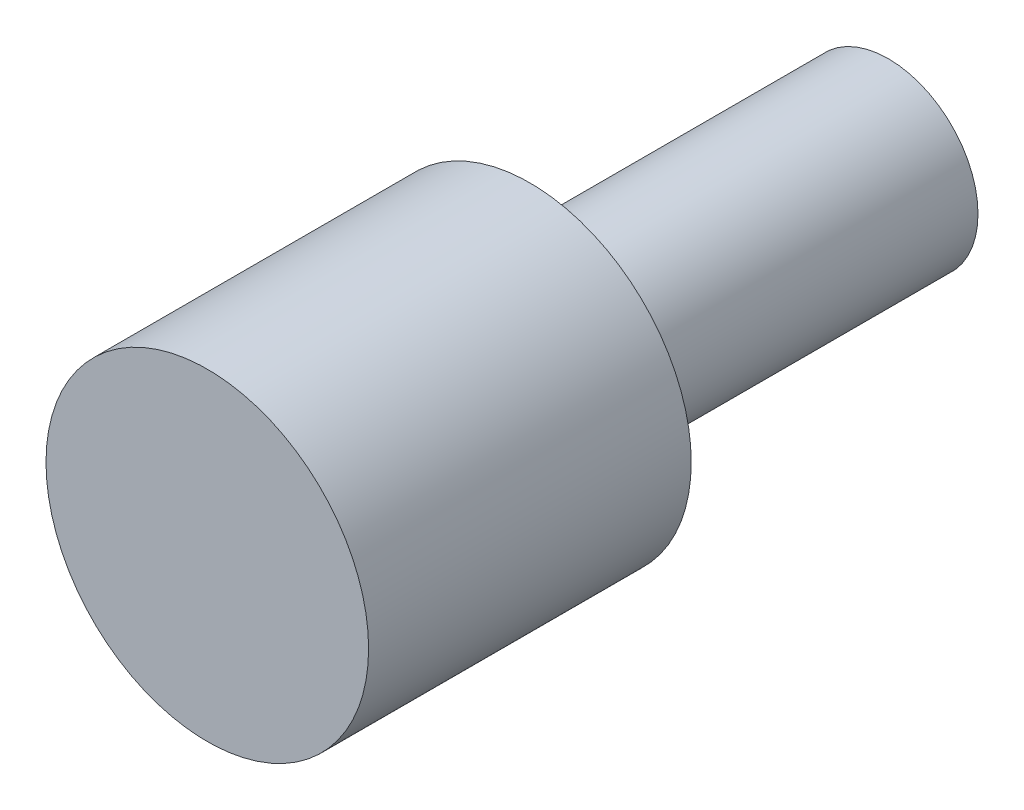
ISO-10303-21;
HEADER;
FILE_DESCRIPTION(('STEP AP214'),'2;1');
FILE_NAME('part.step','',(''),(''),'','','');
FILE_SCHEMA(('AUTOMOTIVE_DESIGN { 1 0 10303 214 1 1 1 1 }'));
ENDSEC;
DATA;
#1=APPLICATION_CONTEXT('core data for automotive mechanical design processes');
#2=APPLICATION_PROTOCOL_DEFINITION('international standard','automotive_design',2000,#1);
#3=PRODUCT_CONTEXT('',#1,'mechanical');
#4=PRODUCT('Part','Part','',(#3));
#5=PRODUCT_RELATED_PRODUCT_CATEGORY('part','',(#4));
#6=PRODUCT_DEFINITION_FORMATION('','',#4);
#7=PRODUCT_DEFINITION_CONTEXT('part definition',#1,'design');
#8=PRODUCT_DEFINITION('design','',#6,#7);
#9=PRODUCT_DEFINITION_SHAPE('','',#8);
#10=(LENGTH_UNIT() NAMED_UNIT(*) SI_UNIT(.MILLI.,.METRE.));
#11=(NAMED_UNIT(*) PLANE_ANGLE_UNIT() SI_UNIT($,.RADIAN.));
#12=(NAMED_UNIT(*) SI_UNIT($,.STERADIAN.) SOLID_ANGLE_UNIT());
#13=UNCERTAINTY_MEASURE_WITH_UNIT(LENGTH_MEASURE(1.E-05),#10,'distance_accuracy_value','');
#14=(GEOMETRIC_REPRESENTATION_CONTEXT(3) GLOBAL_UNCERTAINTY_ASSIGNED_CONTEXT((#13)) GLOBAL_UNIT_ASSIGNED_CONTEXT((#10,
#11,#12)) REPRESENTATION_CONTEXT('',''));
#15=CARTESIAN_POINT('',(0.,0.,0.));
#16=DIRECTION('',(0.,0.,1.));
#17=DIRECTION('',(1.,0.,0.));
#18=AXIS2_PLACEMENT_3D('',#15,#16,#17);
#19=CARTESIAN_POINT('',(0.,0.,10.));
#20=DIRECTION('',(0.,0.,-1.));
#21=DIRECTION('',(-1.,0.,0.));
#22=AXIS2_PLACEMENT_3D('',#19,#20,#21);
#23=CYLINDRICAL_SURFACE('',#22,2.5);
#24=CARTESIAN_POINT('',(0.,0.,10.));
#25=DIRECTION('',(0.,0.,1.));
#26=DIRECTION('',(1.,0.,0.));
#27=AXIS2_PLACEMENT_3D('',#24,#25,#26);
#28=CIRCLE('',#27,2.5);
#29=CARTESIAN_POINT('',(2.5,0.,10.));
#30=VERTEX_POINT('',#29);
#31=EDGE_CURVE('E12',#30,#30,#28,.T.);
#32=ORIENTED_EDGE('',*,*,#31,.F.);
#33=EDGE_LOOP('',(#32));
#34=FACE_BOUND('',#33,.T.);
#35=CARTESIAN_POINT('',(0.,0.,0.));
#36=DIRECTION('',(0.,0.,1.));
#37=DIRECTION('',(1.,0.,0.));
#38=AXIS2_PLACEMENT_3D('',#35,#36,#37);
#39=CIRCLE('',#38,2.5);
#40=CARTESIAN_POINT('',(2.5,0.,0.));
#41=VERTEX_POINT('',#40);
#42=EDGE_CURVE('E45',#41,#41,#39,.T.);
#43=ORIENTED_EDGE('',*,*,#42,.T.);
#44=EDGE_LOOP('',(#43));
#45=FACE_BOUND('',#44,.T.);
#46=ADVANCED_FACE('F42',(#34,#45),#23,.T.);
#47=CARTESIAN_POINT('',(0.,0.,0.));
#48=DIRECTION('',(0.,0.,1.));
#49=DIRECTION('',(1.,0.,0.));
#50=AXIS2_PLACEMENT_3D('',#47,#48,#49);
#51=PLANE('',#50);
#52=ORIENTED_EDGE('',*,*,#42,.F.);
#53=EDGE_LOOP('',(#52));
#54=FACE_BOUND('',#53,.T.);
#55=ADVANCED_FACE('F65',(#54),#51,.F.);
#56=CARTESIAN_POINT('',(0.,0.,19.));
#57=DIRECTION('',(0.,0.,-1.));
#58=DIRECTION('',(-1.,0.,0.));
#59=AXIS2_PLACEMENT_3D('',#56,#57,#58);
#60=CYLINDRICAL_SURFACE('',#59,4.5);
#61=CARTESIAN_POINT('',(0.,0.,19.));
#62=DIRECTION('',(0.,0.,1.));
#63=DIRECTION('',(1.,0.,0.));
#64=AXIS2_PLACEMENT_3D('',#61,#62,#63);
#65=CIRCLE('',#64,4.5);
#66=CARTESIAN_POINT('',(4.5,0.,19.));
#67=VERTEX_POINT('',#66);
#68=EDGE_CURVE('E52',#67,#67,#65,.T.);
#69=ORIENTED_EDGE('',*,*,#68,.F.);
#70=EDGE_LOOP('',(#69));
#71=FACE_BOUND('',#70,.T.);
#72=CARTESIAN_POINT('',(0.,0.,10.));
#73=DIRECTION('',(0.,0.,1.));
#74=DIRECTION('',(1.,0.,0.));
#75=AXIS2_PLACEMENT_3D('',#72,#73,#74);
#76=CIRCLE('',#75,4.5);
#77=CARTESIAN_POINT('',(4.5,0.,10.));
#78=VERTEX_POINT('',#77);
#79=EDGE_CURVE('E54',#78,#78,#76,.T.);
#80=ORIENTED_EDGE('',*,*,#79,.T.);
#81=EDGE_LOOP('',(#80));
#82=FACE_BOUND('',#81,.T.);
#83=ADVANCED_FACE('F62',(#71,#82),#60,.T.);
#84=CARTESIAN_POINT('',(0.,0.,19.));
#85=DIRECTION('',(0.,0.,1.));
#86=DIRECTION('',(1.,0.,0.));
#87=AXIS2_PLACEMENT_3D('',#84,#85,#86);
#88=PLANE('',#87);
#89=ORIENTED_EDGE('',*,*,#68,.T.);
#90=EDGE_LOOP('',(#89));
#91=FACE_BOUND('',#90,.T.);
#92=ADVANCED_FACE('F60',(#91),#88,.T.);
#93=CARTESIAN_POINT('',(0.,0.,10.));
#94=DIRECTION('',(0.,0.,1.));
#95=DIRECTION('',(1.,0.,0.));
#96=AXIS2_PLACEMENT_3D('',#93,#94,#95);
#97=PLANE('',#96);
#98=ORIENTED_EDGE('',*,*,#31,.T.);
#99=EDGE_LOOP('',(#98));
#100=FACE_BOUND('',#99,.T.);
#101=ORIENTED_EDGE('',*,*,#79,.F.);
#102=EDGE_LOOP('',(#101));
#103=FACE_BOUND('',#102,.T.);
#104=ADVANCED_FACE('F69',(#100,#103),#97,.F.);
#105=CLOSED_SHELL('',(#46,#55,#83,#92,#104));
#106=MANIFOLD_SOLID_BREP('B2',#105);
#107=ADVANCED_BREP_SHAPE_REPRESENTATION('',(#18,#106),#14);
#108=SHAPE_DEFINITION_REPRESENTATION(#9,#107);
ENDSEC;
END-ISO-10303-21;
